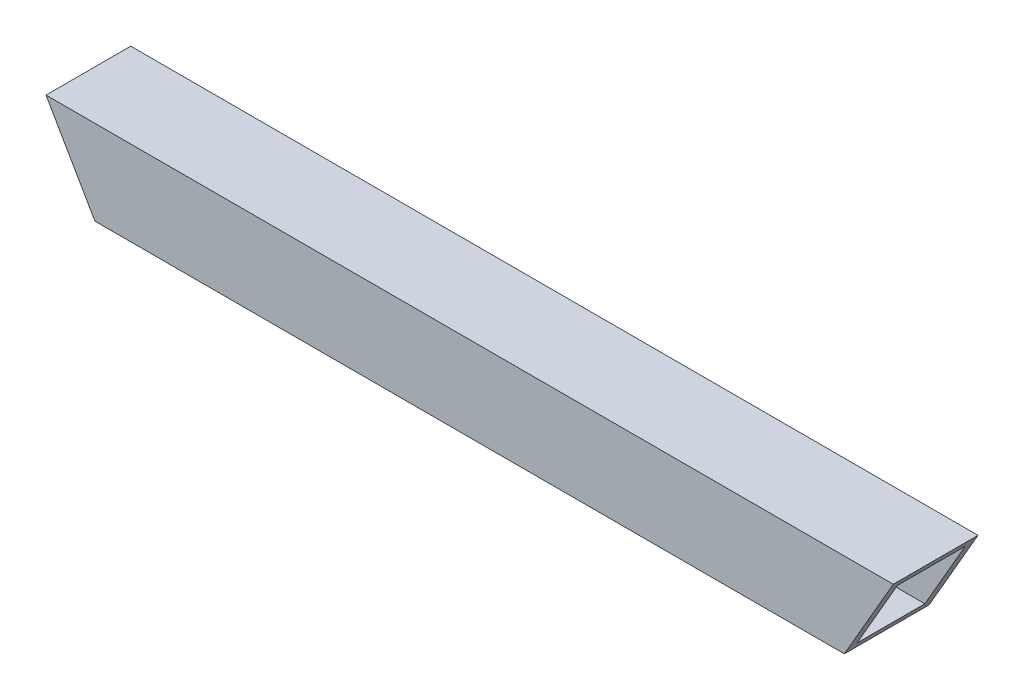
ISO-10303-21;
HEADER;
FILE_DESCRIPTION(('STEP AP214'),'2;1');
FILE_NAME('part.step','',(''),(''),'','','');
FILE_SCHEMA(('AUTOMOTIVE_DESIGN { 1 0 10303 214 1 1 1 1 }'));
ENDSEC;
DATA;
#1=APPLICATION_CONTEXT('core data for automotive mechanical design processes');
#2=APPLICATION_PROTOCOL_DEFINITION('international standard','automotive_design',2000,#1);
#3=PRODUCT_CONTEXT('',#1,'mechanical');
#4=PRODUCT('Part','Part','',(#3));
#5=PRODUCT_RELATED_PRODUCT_CATEGORY('part','',(#4));
#6=PRODUCT_DEFINITION_FORMATION('','',#4);
#7=PRODUCT_DEFINITION_CONTEXT('part definition',#1,'design');
#8=PRODUCT_DEFINITION('design','',#6,#7);
#9=PRODUCT_DEFINITION_SHAPE('','',#8);
#10=(LENGTH_UNIT() NAMED_UNIT(*) SI_UNIT(.MILLI.,.METRE.));
#11=(NAMED_UNIT(*) PLANE_ANGLE_UNIT() SI_UNIT($,.RADIAN.));
#12=(NAMED_UNIT(*) SI_UNIT($,.STERADIAN.) SOLID_ANGLE_UNIT());
#13=UNCERTAINTY_MEASURE_WITH_UNIT(LENGTH_MEASURE(1.E-05),#10,'distance_accuracy_value','');
#14=(GEOMETRIC_REPRESENTATION_CONTEXT(3) GLOBAL_UNCERTAINTY_ASSIGNED_CONTEXT((#13)) GLOBAL_UNIT_ASSIGNED_CONTEXT((#10,
#11,#12)) REPRESENTATION_CONTEXT('',''));
#15=CARTESIAN_POINT('',(0.,0.,0.));
#16=DIRECTION('',(0.,0.,1.));
#17=DIRECTION('',(1.,0.,0.));
#18=AXIS2_PLACEMENT_3D('',#15,#16,#17);
#19=CARTESIAN_POINT('',(-28.8675134594816,-50.0000000000001,50.));
#20=DIRECTION('',(-0.866025403784436,0.500000000000004,0.));
#21=DIRECTION('',(-0.500000000000004,-0.866025403784436,0.));
#22=AXIS2_PLACEMENT_3D('',#19,#20,#21);
#23=PLANE('',#22);
#24=DIRECTION('',(0.,0.,-1.));
#25=VECTOR('',#24,1.);
#26=CARTESIAN_POINT('',(-26.3675134594816,-45.6698729810779,4.99999999999999));
#27=LINE('',#26,#25);
#28=CARTESIAN_POINT('',(-26.3675134594816,-45.6698729810779,45.));
#29=VERTEX_POINT('',#28);
#30=CARTESIAN_POINT('',(-26.3675134594816,-45.6698729810779,4.99999999999999));
#31=VERTEX_POINT('',#30);
#32=EDGE_CURVE('E110',#29,#31,#27,.T.);
#33=ORIENTED_EDGE('',*,*,#32,.F.);
#34=DIRECTION('',(-0.500000000000004,-0.866025403784437,0.));
#35=VECTOR('',#34,1.);
#36=CARTESIAN_POINT('',(-26.3675134594816,-45.6698729810779,45.));
#37=LINE('',#36,#35);
#38=CARTESIAN_POINT('',(-2.50000000000002,-4.33012701892218,45.));
#39=VERTEX_POINT('',#38);
#40=EDGE_CURVE('E48',#39,#29,#37,.T.);
#41=ORIENTED_EDGE('',*,*,#40,.F.);
#42=DIRECTION('',(0.,0.,1.));
#43=VECTOR('',#42,1.);
#44=CARTESIAN_POINT('',(-2.50000000000002,-4.33012701892218,45.));
#45=LINE('',#44,#43);
#46=CARTESIAN_POINT('',(-2.50000000000002,-4.33012701892218,5.));
#47=VERTEX_POINT('',#46);
#48=EDGE_CURVE('E116',#47,#39,#45,.T.);
#49=ORIENTED_EDGE('',*,*,#48,.F.);
#50=DIRECTION('',(0.500000000000004,0.866025403784437,0.));
#51=VECTOR('',#50,1.);
#52=CARTESIAN_POINT('',(-2.50000000000002,-4.33012701892218,5.));
#53=LINE('',#52,#51);
#54=EDGE_CURVE('E101',#31,#47,#53,.T.);
#55=ORIENTED_EDGE('',*,*,#54,.F.);
#56=EDGE_LOOP('',(#33,#41,#49,#55));
#57=FACE_BOUND('',#56,.T.);
#58=DIRECTION('',(0.500000000000004,0.866025403784436,0.));
#59=VECTOR('',#58,1.);
#60=CARTESIAN_POINT('',(-28.8675134594816,-50.0000000000001,0.));
#61=LINE('',#60,#59);
#62=CARTESIAN_POINT('',(-28.8675134594816,-50.0000000000001,0.));
#63=VERTEX_POINT('',#62);
#64=CARTESIAN_POINT('',(0.,0.,0.));
#65=VERTEX_POINT('',#64);
#66=EDGE_CURVE('E123',#63,#65,#61,.T.);
#67=ORIENTED_EDGE('',*,*,#66,.T.);
#68=DIRECTION('',(0.,0.,-1.));
#69=VECTOR('',#68,1.);
#70=CARTESIAN_POINT('',(0.,0.,50.));
#71=LINE('',#70,#69);
#72=CARTESIAN_POINT('',(0.,0.,50.));
#73=VERTEX_POINT('',#72);
#74=EDGE_CURVE('E152',#73,#65,#71,.T.);
#75=ORIENTED_EDGE('',*,*,#74,.F.);
#76=DIRECTION('',(0.500000000000004,0.866025403784436,0.));
#77=VECTOR('',#76,1.);
#78=CARTESIAN_POINT('',(-28.8675134594816,-50.0000000000001,50.));
#79=LINE('',#78,#77);
#80=CARTESIAN_POINT('',(-28.8675134594816,-50.0000000000001,50.));
#81=VERTEX_POINT('',#80);
#82=EDGE_CURVE('E126',#81,#73,#79,.T.);
#83=ORIENTED_EDGE('',*,*,#82,.F.);
#84=DIRECTION('',(0.,0.,-1.));
#85=VECTOR('',#84,1.);
#86=CARTESIAN_POINT('',(-28.8675134594816,-50.0000000000001,50.));
#87=LINE('',#86,#85);
#88=EDGE_CURVE('E136',#81,#63,#87,.T.);
#89=ORIENTED_EDGE('',*,*,#88,.T.);
#90=EDGE_LOOP('',(#67,#75,#83,#89));
#91=FACE_BOUND('',#90,.T.);
#92=ADVANCED_FACE('F34',(#57,#91),#23,.F.);
#93=CARTESIAN_POINT('',(0.,0.,50.));
#94=DIRECTION('',(0.,-1.,0.));
#95=DIRECTION('',(1.,0.,0.));
#96=AXIS2_PLACEMENT_3D('',#93,#94,#95);
#97=PLANE('',#96);
#98=DIRECTION('',(-1.,0.,0.));
#99=VECTOR('',#98,1.);
#100=CARTESIAN_POINT('',(0.,0.,0.));
#101=LINE('',#100,#99);
#102=CARTESIAN_POINT('',(-500.,0.,0.));
#103=VERTEX_POINT('',#102);
#104=EDGE_CURVE('E139',#65,#103,#101,.T.);
#105=ORIENTED_EDGE('',*,*,#104,.T.);
#106=DIRECTION('',(0.,0.,-1.));
#107=VECTOR('',#106,1.);
#108=CARTESIAN_POINT('',(-500.,0.,50.));
#109=LINE('',#108,#107);
#110=CARTESIAN_POINT('',(-500.,0.,50.));
#111=VERTEX_POINT('',#110);
#112=EDGE_CURVE('E149',#111,#103,#109,.T.);
#113=ORIENTED_EDGE('',*,*,#112,.F.);
#114=DIRECTION('',(-1.,0.,0.));
#115=VECTOR('',#114,1.);
#116=CARTESIAN_POINT('',(0.,0.,50.));
#117=LINE('',#116,#115);
#118=EDGE_CURVE('E129',#73,#111,#117,.T.);
#119=ORIENTED_EDGE('',*,*,#118,.F.);
#120=ORIENTED_EDGE('',*,*,#74,.T.);
#121=EDGE_LOOP('',(#105,#113,#119,#120));
#122=FACE_BOUND('',#121,.T.);
#123=ADVANCED_FACE('F179',(#122),#97,.F.);
#124=CARTESIAN_POINT('',(-500.,0.,50.));
#125=DIRECTION('',(0.866025403784436,0.500000000000005,0.));
#126=DIRECTION('',(-0.500000000000005,0.866025403784436,0.));
#127=AXIS2_PLACEMENT_3D('',#124,#125,#126);
#128=PLANE('',#127);
#129=DIRECTION('',(0.,0.,1.));
#130=VECTOR('',#129,1.);
#131=CARTESIAN_POINT('',(-497.5,-4.33012701892224,50.));
#132=LINE('',#131,#130);
#133=CARTESIAN_POINT('',(-497.5,-4.33012701892225,5.));
#134=VERTEX_POINT('',#133);
#135=CARTESIAN_POINT('',(-497.5,-4.33012701892224,45.));
#136=VERTEX_POINT('',#135);
#137=EDGE_CURVE('E41',#134,#136,#132,.T.);
#138=ORIENTED_EDGE('',*,*,#137,.T.);
#139=DIRECTION('',(0.500000000000005,-0.866025403784436,0.));
#140=VECTOR('',#139,1.);
#141=CARTESIAN_POINT('',(-500.,0.,45.));
#142=LINE('',#141,#140);
#143=CARTESIAN_POINT('',(-473.632486540518,-45.669872981078,45.));
#144=VERTEX_POINT('',#143);
#145=EDGE_CURVE('E11',#136,#144,#142,.T.);
#146=ORIENTED_EDGE('',*,*,#145,.T.);
#147=DIRECTION('',(0.,0.,-1.));
#148=VECTOR('',#147,1.);
#149=CARTESIAN_POINT('',(-473.632486540518,-45.669872981078,50.));
#150=LINE('',#149,#148);
#151=CARTESIAN_POINT('',(-473.632486540518,-45.669872981078,4.99999999999999));
#152=VERTEX_POINT('',#151);
#153=EDGE_CURVE('E155',#144,#152,#150,.T.);
#154=ORIENTED_EDGE('',*,*,#153,.T.);
#155=DIRECTION('',(-0.500000000000005,0.866025403784436,0.));
#156=VECTOR('',#155,1.);
#157=CARTESIAN_POINT('',(-500.,0.,5.));
#158=LINE('',#157,#156);
#159=EDGE_CURVE('E104',#152,#134,#158,.T.);
#160=ORIENTED_EDGE('',*,*,#159,.T.);
#161=EDGE_LOOP('',(#138,#146,#154,#160));
#162=FACE_BOUND('',#161,.T.);
#163=DIRECTION('',(0.500000000000005,-0.866025403784436,0.));
#164=VECTOR('',#163,1.);
#165=CARTESIAN_POINT('',(-500.,0.,0.));
#166=LINE('',#165,#164);
#167=CARTESIAN_POINT('',(-471.132486540518,-50.0000000000001,0.));
#168=VERTEX_POINT('',#167);
#169=EDGE_CURVE('E141',#103,#168,#166,.T.);
#170=ORIENTED_EDGE('',*,*,#169,.T.);
#171=DIRECTION('',(0.,0.,-1.));
#172=VECTOR('',#171,1.);
#173=CARTESIAN_POINT('',(-471.132486540518,-50.0000000000001,50.));
#174=LINE('',#173,#172);
#175=CARTESIAN_POINT('',(-471.132486540518,-50.0000000000001,50.));
#176=VERTEX_POINT('',#175);
#177=EDGE_CURVE('E146',#176,#168,#174,.T.);
#178=ORIENTED_EDGE('',*,*,#177,.F.);
#179=DIRECTION('',(0.500000000000005,-0.866025403784436,0.));
#180=VECTOR('',#179,1.);
#181=CARTESIAN_POINT('',(-500.,0.,50.));
#182=LINE('',#181,#180);
#183=EDGE_CURVE('E132',#111,#176,#182,.T.);
#184=ORIENTED_EDGE('',*,*,#183,.F.);
#185=ORIENTED_EDGE('',*,*,#112,.T.);
#186=EDGE_LOOP('',(#170,#178,#184,#185));
#187=FACE_BOUND('',#186,.T.);
#188=ADVANCED_FACE('F159',(#162,#187),#128,.F.);
#189=CARTESIAN_POINT('',(-471.132486540518,-50.0000000000001,50.));
#190=DIRECTION('',(0.,1.,0.));
#191=DIRECTION('',(0.,0.,1.));
#192=AXIS2_PLACEMENT_3D('',#189,#190,#191);
#193=PLANE('',#192);
#194=DIRECTION('',(1.,0.,0.));
#195=VECTOR('',#194,1.);
#196=CARTESIAN_POINT('',(-471.132486540518,-50.0000000000001,0.));
#197=LINE('',#196,#195);
#198=EDGE_CURVE('E130',#168,#63,#197,.T.);
#199=ORIENTED_EDGE('',*,*,#198,.T.);
#200=ORIENTED_EDGE('',*,*,#88,.F.);
#201=DIRECTION('',(1.,0.,0.));
#202=VECTOR('',#201,1.);
#203=CARTESIAN_POINT('',(-471.132486540518,-50.0000000000001,50.));
#204=LINE('',#203,#202);
#205=EDGE_CURVE('E134',#176,#81,#204,.T.);
#206=ORIENTED_EDGE('',*,*,#205,.F.);
#207=ORIENTED_EDGE('',*,*,#177,.T.);
#208=EDGE_LOOP('',(#199,#200,#206,#207));
#209=FACE_BOUND('',#208,.T.);
#210=ADVANCED_FACE('F187',(#209),#193,.F.);
#211=CARTESIAN_POINT('',(0.,0.,50.));
#212=DIRECTION('',(0.,0.,1.));
#213=DIRECTION('',(1.,0.,0.));
#214=AXIS2_PLACEMENT_3D('',#211,#212,#213);
#215=PLANE('',#214);
#216=ORIENTED_EDGE('',*,*,#82,.T.);
#217=ORIENTED_EDGE('',*,*,#118,.T.);
#218=ORIENTED_EDGE('',*,*,#183,.T.);
#219=ORIENTED_EDGE('',*,*,#205,.T.);
#220=EDGE_LOOP('',(#216,#217,#218,#219));
#221=FACE_BOUND('',#220,.T.);
#222=ADVANCED_FACE('F173',(#221),#215,.T.);
#223=CARTESIAN_POINT('',(0.,0.,0.));
#224=DIRECTION('',(0.,0.,1.));
#225=DIRECTION('',(1.,0.,0.));
#226=AXIS2_PLACEMENT_3D('',#223,#224,#225);
#227=PLANE('',#226);
#228=ORIENTED_EDGE('',*,*,#66,.F.);
#229=ORIENTED_EDGE('',*,*,#198,.F.);
#230=ORIENTED_EDGE('',*,*,#169,.F.);
#231=ORIENTED_EDGE('',*,*,#104,.F.);
#232=EDGE_LOOP('',(#228,#229,#230,#231));
#233=FACE_BOUND('',#232,.T.);
#234=ADVANCED_FACE('F166',(#233),#227,.F.);
#235=CARTESIAN_POINT('',(-523.867513459482,-45.669872981078,45.));
#236=DIRECTION('',(0.,0.,1.));
#237=DIRECTION('',(0.,-1.,0.));
#238=AXIS2_PLACEMENT_3D('',#235,#236,#237);
#239=PLANE('',#238);
#240=DIRECTION('',(1.,0.,0.));
#241=VECTOR('',#240,1.);
#242=CARTESIAN_POINT('',(-500.,-4.33012701892224,45.));
#243=LINE('',#242,#241);
#244=EDGE_CURVE('E121',#136,#39,#243,.T.);
#245=ORIENTED_EDGE('',*,*,#244,.T.);
#246=ORIENTED_EDGE('',*,*,#40,.T.);
#247=DIRECTION('',(1.,0.,0.));
#248=VECTOR('',#247,1.);
#249=CARTESIAN_POINT('',(-523.867513459482,-45.669872981078,45.));
#250=LINE('',#249,#248);
#251=EDGE_CURVE('E107',#144,#29,#250,.T.);
#252=ORIENTED_EDGE('',*,*,#251,.F.);
#253=ORIENTED_EDGE('',*,*,#145,.F.);
#254=EDGE_LOOP('',(#245,#246,#252,#253));
#255=FACE_BOUND('',#254,.T.);
#256=ADVANCED_FACE('F164',(#255),#239,.F.);
#257=CARTESIAN_POINT('',(-500.,-4.33012701892224,45.));
#258=DIRECTION('',(0.,1.,0.));
#259=DIRECTION('',(-1.,0.,0.));
#260=AXIS2_PLACEMENT_3D('',#257,#258,#259);
#261=PLANE('',#260);
#262=DIRECTION('',(1.,0.,0.));
#263=VECTOR('',#262,1.);
#264=CARTESIAN_POINT('',(-500.,-4.33012701892224,5.));
#265=LINE('',#264,#263);
#266=EDGE_CURVE('E106',#134,#47,#265,.T.);
#267=ORIENTED_EDGE('',*,*,#266,.T.);
#268=ORIENTED_EDGE('',*,*,#48,.T.);
#269=ORIENTED_EDGE('',*,*,#244,.F.);
#270=ORIENTED_EDGE('',*,*,#137,.F.);
#271=EDGE_LOOP('',(#267,#268,#269,#270));
#272=FACE_BOUND('',#271,.T.);
#273=ADVANCED_FACE('F163',(#272),#261,.F.);
#274=CARTESIAN_POINT('',(-500.,-4.33012701892224,5.));
#275=DIRECTION('',(0.,0.,-1.));
#276=DIRECTION('',(0.,1.,0.));
#277=AXIS2_PLACEMENT_3D('',#274,#275,#276);
#278=PLANE('',#277);
#279=DIRECTION('',(1.,0.,0.));
#280=VECTOR('',#279,1.);
#281=CARTESIAN_POINT('',(-523.867513459482,-45.669872981078,4.99999999999999));
#282=LINE('',#281,#280);
#283=EDGE_CURVE('E56',#152,#31,#282,.T.);
#284=ORIENTED_EDGE('',*,*,#283,.T.);
#285=ORIENTED_EDGE('',*,*,#54,.T.);
#286=ORIENTED_EDGE('',*,*,#266,.F.);
#287=ORIENTED_EDGE('',*,*,#159,.F.);
#288=EDGE_LOOP('',(#284,#285,#286,#287));
#289=FACE_BOUND('',#288,.T.);
#290=ADVANCED_FACE('F98',(#289),#278,.F.);
#291=CARTESIAN_POINT('',(-523.867513459482,-45.669872981078,4.99999999999999));
#292=DIRECTION('',(0.,-1.,0.));
#293=DIRECTION('',(1.,0.,0.));
#294=AXIS2_PLACEMENT_3D('',#291,#292,#293);
#295=PLANE('',#294);
#296=ORIENTED_EDGE('',*,*,#251,.T.);
#297=ORIENTED_EDGE('',*,*,#32,.T.);
#298=ORIENTED_EDGE('',*,*,#283,.F.);
#299=ORIENTED_EDGE('',*,*,#153,.F.);
#300=EDGE_LOOP('',(#296,#297,#298,#299));
#301=FACE_BOUND('',#300,.T.);
#302=ADVANCED_FACE('F111',(#301),#295,.F.);
#303=CLOSED_SHELL('',(#92,#123,#188,#210,#222,#234,#256,#273,#290,#302));
#304=MANIFOLD_SOLID_BREP('B2',#303);
#305=ADVANCED_BREP_SHAPE_REPRESENTATION('',(#18,#304),#14);
#306=SHAPE_DEFINITION_REPRESENTATION(#9,#305);
ENDSEC;
END-ISO-10303-21;
